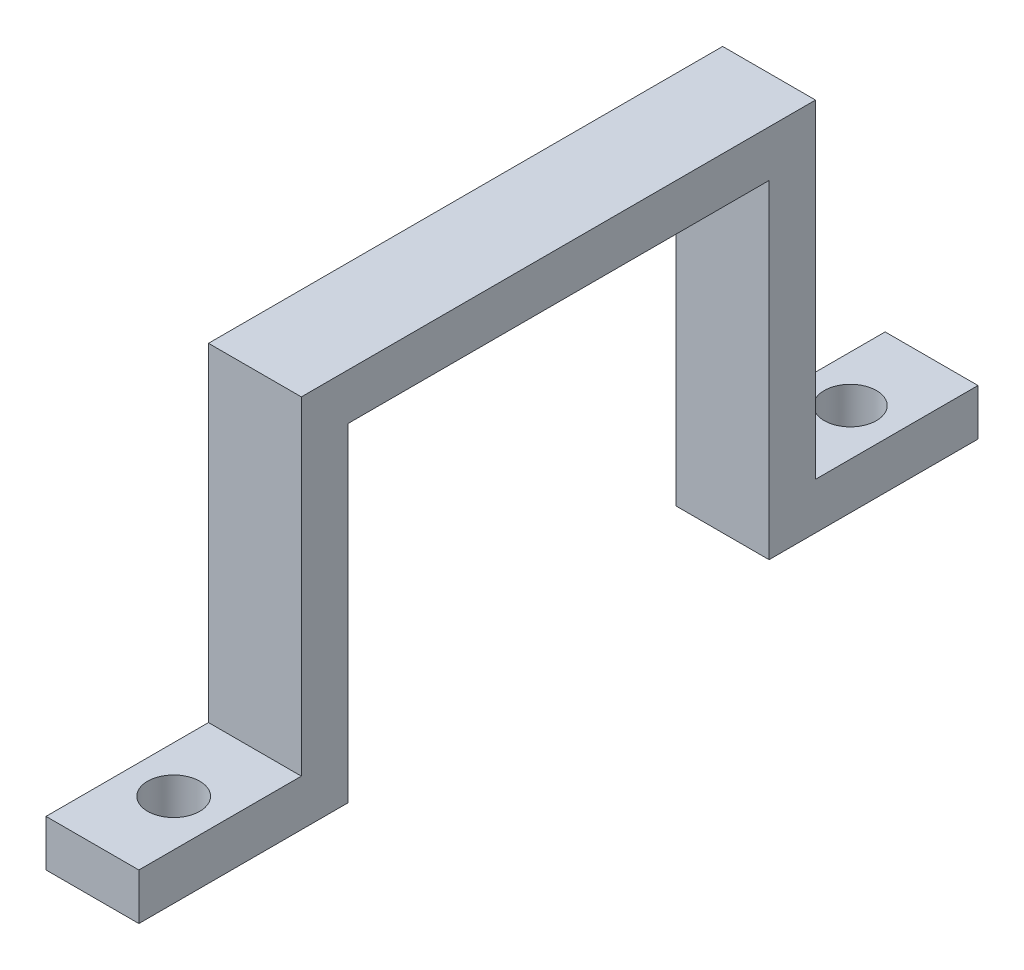
ISO-10303-21;
HEADER;
FILE_DESCRIPTION(('STEP AP214'),'2;1');
FILE_NAME('part.step','',(''),(''),'','','');
FILE_SCHEMA(('AUTOMOTIVE_DESIGN { 1 0 10303 214 1 1 1 1 }'));
ENDSEC;
DATA;
#1=APPLICATION_CONTEXT('core data for automotive mechanical design processes');
#2=APPLICATION_PROTOCOL_DEFINITION('international standard','automotive_design',2000,#1);
#3=PRODUCT_CONTEXT('',#1,'mechanical');
#4=PRODUCT('Part','Part','',(#3));
#5=PRODUCT_RELATED_PRODUCT_CATEGORY('part','',(#4));
#6=PRODUCT_DEFINITION_FORMATION('','',#4);
#7=PRODUCT_DEFINITION_CONTEXT('part definition',#1,'design');
#8=PRODUCT_DEFINITION('design','',#6,#7);
#9=PRODUCT_DEFINITION_SHAPE('','',#8);
#10=(LENGTH_UNIT() NAMED_UNIT(*) SI_UNIT(.MILLI.,.METRE.));
#11=(NAMED_UNIT(*) PLANE_ANGLE_UNIT() SI_UNIT($,.RADIAN.));
#12=(NAMED_UNIT(*) SI_UNIT($,.STERADIAN.) SOLID_ANGLE_UNIT());
#13=UNCERTAINTY_MEASURE_WITH_UNIT(LENGTH_MEASURE(1.E-05),#10,'distance_accuracy_value','');
#14=(GEOMETRIC_REPRESENTATION_CONTEXT(3) GLOBAL_UNCERTAINTY_ASSIGNED_CONTEXT((#13)) GLOBAL_UNIT_ASSIGNED_CONTEXT((#10,
#11,#12)) REPRESENTATION_CONTEXT('',''));
#15=CARTESIAN_POINT('',(0.,0.,0.));
#16=DIRECTION('',(0.,0.,1.));
#17=DIRECTION('',(1.,0.,0.));
#18=AXIS2_PLACEMENT_3D('',#15,#16,#17);
#19=CARTESIAN_POINT('',(4.,4.,36.15));
#20=DIRECTION('',(0.,0.,-1.));
#21=DIRECTION('',(-1.,0.,0.));
#22=AXIS2_PLACEMENT_3D('',#19,#20,#21);
#23=PLANE('',#22);
#24=DIRECTION('',(0.,-1.,0.));
#25=VECTOR('',#24,1.);
#26=CARTESIAN_POINT('',(-4.,4.,36.15));
#27=LINE('',#26,#25);
#28=CARTESIAN_POINT('',(-4.,4.,36.15));
#29=VERTEX_POINT('',#28);
#30=CARTESIAN_POINT('',(-4.,0.,36.15));
#31=VERTEX_POINT('',#30);
#32=EDGE_CURVE('E175',#29,#31,#27,.T.);
#33=ORIENTED_EDGE('',*,*,#32,.T.);
#34=DIRECTION('',(-1.,0.,0.));
#35=VECTOR('',#34,1.);
#36=CARTESIAN_POINT('',(4.,0.,36.15));
#37=LINE('',#36,#35);
#38=CARTESIAN_POINT('',(4.,0.,36.15));
#39=VERTEX_POINT('',#38);
#40=EDGE_CURVE('E11',#39,#31,#37,.T.);
#41=ORIENTED_EDGE('',*,*,#40,.F.);
#42=DIRECTION('',(0.,-1.,0.));
#43=VECTOR('',#42,1.);
#44=CARTESIAN_POINT('',(4.,4.,36.15));
#45=LINE('',#44,#43);
#46=CARTESIAN_POINT('',(4.,4.,36.15));
#47=VERTEX_POINT('',#46);
#48=EDGE_CURVE('E210',#47,#39,#45,.T.);
#49=ORIENTED_EDGE('',*,*,#48,.F.);
#50=DIRECTION('',(-1.,0.,0.));
#51=VECTOR('',#50,1.);
#52=CARTESIAN_POINT('',(4.,4.,36.15));
#53=LINE('',#52,#51);
#54=EDGE_CURVE('E169',#47,#29,#53,.T.);
#55=ORIENTED_EDGE('',*,*,#54,.T.);
#56=EDGE_LOOP('',(#33,#41,#49,#55));
#57=FACE_BOUND('',#56,.T.);
#58=ADVANCED_FACE('F44',(#57),#23,.F.);
#59=CARTESIAN_POINT('',(4.,0.,36.15));
#60=DIRECTION('',(0.,1.,0.));
#61=DIRECTION('',(0.,0.,1.));
#62=AXIS2_PLACEMENT_3D('',#59,#60,#61);
#63=PLANE('',#62);
#64=CARTESIAN_POINT('',(0.,0.,29.15));
#65=DIRECTION('',(0.,1.,0.));
#66=DIRECTION('',(0.,0.,1.));
#67=AXIS2_PLACEMENT_3D('',#64,#65,#66);
#68=CIRCLE('',#67,2.25);
#69=CARTESIAN_POINT('',(0.,0.,31.4));
#70=VERTEX_POINT('',#69);
#71=EDGE_CURVE('E242',#70,#70,#68,.F.);
#72=ORIENTED_EDGE('',*,*,#71,.F.);
#73=EDGE_LOOP('',(#72));
#74=FACE_BOUND('',#73,.T.);
#75=DIRECTION('',(0.,0.,-1.));
#76=VECTOR('',#75,1.);
#77=CARTESIAN_POINT('',(-4.,0.,36.15));
#78=LINE('',#77,#76);
#79=CARTESIAN_POINT('',(-4.,0.,18.15));
#80=VERTEX_POINT('',#79);
#81=EDGE_CURVE('E177',#31,#80,#78,.T.);
#82=ORIENTED_EDGE('',*,*,#81,.T.);
#83=DIRECTION('',(-1.,0.,0.));
#84=VECTOR('',#83,1.);
#85=CARTESIAN_POINT('',(4.,0.,18.15));
#86=LINE('',#85,#84);
#87=CARTESIAN_POINT('',(4.,0.,18.15));
#88=VERTEX_POINT('',#87);
#89=EDGE_CURVE('E54',#88,#80,#86,.T.);
#90=ORIENTED_EDGE('',*,*,#89,.F.);
#91=DIRECTION('',(0.,0.,-1.));
#92=VECTOR('',#91,1.);
#93=CARTESIAN_POINT('',(4.,0.,36.15));
#94=LINE('',#93,#92);
#95=EDGE_CURVE('E118',#39,#88,#94,.T.);
#96=ORIENTED_EDGE('',*,*,#95,.F.);
#97=ORIENTED_EDGE('',*,*,#40,.T.);
#98=EDGE_LOOP('',(#82,#90,#96,#97));
#99=FACE_BOUND('',#98,.T.);
#100=ADVANCED_FACE('F309',(#74,#99),#63,.F.);
#101=CARTESIAN_POINT('',(4.,0.,18.15));
#102=DIRECTION('',(0.,0.,1.));
#103=DIRECTION('',(1.,0.,0.));
#104=AXIS2_PLACEMENT_3D('',#101,#102,#103);
#105=PLANE('',#104);
#106=DIRECTION('',(0.,1.,0.));
#107=VECTOR('',#106,1.);
#108=CARTESIAN_POINT('',(-4.,0.,18.15));
#109=LINE('',#108,#107);
#110=CARTESIAN_POINT('',(-4.,28.3,18.15));
#111=VERTEX_POINT('',#110);
#112=EDGE_CURVE('E178',#80,#111,#109,.T.);
#113=ORIENTED_EDGE('',*,*,#112,.T.);
#114=DIRECTION('',(-1.,0.,0.));
#115=VECTOR('',#114,1.);
#116=CARTESIAN_POINT('',(4.,28.3,18.15));
#117=LINE('',#116,#115);
#118=CARTESIAN_POINT('',(4.,28.3,18.15));
#119=VERTEX_POINT('',#118);
#120=EDGE_CURVE('E231',#119,#111,#117,.T.);
#121=ORIENTED_EDGE('',*,*,#120,.F.);
#122=DIRECTION('',(0.,1.,0.));
#123=VECTOR('',#122,1.);
#124=CARTESIAN_POINT('',(4.,0.,18.15));
#125=LINE('',#124,#123);
#126=EDGE_CURVE('E261',#88,#119,#125,.T.);
#127=ORIENTED_EDGE('',*,*,#126,.F.);
#128=ORIENTED_EDGE('',*,*,#89,.T.);
#129=EDGE_LOOP('',(#113,#121,#127,#128));
#130=FACE_BOUND('',#129,.T.);
#131=ADVANCED_FACE('F312',(#130),#105,.F.);
#132=CARTESIAN_POINT('',(4.,28.3,18.15));
#133=DIRECTION('',(0.,1.,0.));
#134=DIRECTION('',(0.,0.,1.));
#135=AXIS2_PLACEMENT_3D('',#132,#133,#134);
#136=PLANE('',#135);
#137=DIRECTION('',(0.,0.,-1.));
#138=VECTOR('',#137,1.);
#139=CARTESIAN_POINT('',(-4.,28.3,18.15));
#140=LINE('',#139,#138);
#141=CARTESIAN_POINT('',(-4.,28.3,-18.15));
#142=VERTEX_POINT('',#141);
#143=EDGE_CURVE('E181',#111,#142,#140,.T.);
#144=ORIENTED_EDGE('',*,*,#143,.T.);
#145=DIRECTION('',(-1.,0.,0.));
#146=VECTOR('',#145,1.);
#147=CARTESIAN_POINT('',(4.,28.3,-18.15));
#148=LINE('',#147,#146);
#149=CARTESIAN_POINT('',(4.,28.3,-18.15));
#150=VERTEX_POINT('',#149);
#151=EDGE_CURVE('E229',#150,#142,#148,.T.);
#152=ORIENTED_EDGE('',*,*,#151,.F.);
#153=DIRECTION('',(0.,0.,-1.));
#154=VECTOR('',#153,1.);
#155=CARTESIAN_POINT('',(4.,28.3,18.15));
#156=LINE('',#155,#154);
#157=EDGE_CURVE('E262',#119,#150,#156,.T.);
#158=ORIENTED_EDGE('',*,*,#157,.F.);
#159=ORIENTED_EDGE('',*,*,#120,.T.);
#160=EDGE_LOOP('',(#144,#152,#158,#159));
#161=FACE_BOUND('',#160,.T.);
#162=ADVANCED_FACE('F321',(#161),#136,.F.);
#163=CARTESIAN_POINT('',(4.,28.3,-18.15));
#164=DIRECTION('',(0.,0.,-1.));
#165=DIRECTION('',(-1.,0.,0.));
#166=AXIS2_PLACEMENT_3D('',#163,#164,#165);
#167=PLANE('',#166);
#168=DIRECTION('',(0.,-1.,0.));
#169=VECTOR('',#168,1.);
#170=CARTESIAN_POINT('',(-4.,28.3,-18.15));
#171=LINE('',#170,#169);
#172=CARTESIAN_POINT('',(-4.,0.,-18.15));
#173=VERTEX_POINT('',#172);
#174=EDGE_CURVE('E186',#142,#173,#171,.T.);
#175=ORIENTED_EDGE('',*,*,#174,.T.);
#176=DIRECTION('',(-1.,0.,0.));
#177=VECTOR('',#176,1.);
#178=CARTESIAN_POINT('',(4.,0.,-18.15));
#179=LINE('',#178,#177);
#180=CARTESIAN_POINT('',(4.,0.,-18.15));
#181=VERTEX_POINT('',#180);
#182=EDGE_CURVE('E226',#181,#173,#179,.T.);
#183=ORIENTED_EDGE('',*,*,#182,.F.);
#184=DIRECTION('',(0.,-1.,0.));
#185=VECTOR('',#184,1.);
#186=CARTESIAN_POINT('',(4.,28.3,-18.15));
#187=LINE('',#186,#185);
#188=EDGE_CURVE('E270',#150,#181,#187,.T.);
#189=ORIENTED_EDGE('',*,*,#188,.F.);
#190=ORIENTED_EDGE('',*,*,#151,.T.);
#191=EDGE_LOOP('',(#175,#183,#189,#190));
#192=FACE_BOUND('',#191,.T.);
#193=ADVANCED_FACE('F330',(#192),#167,.F.);
#194=CARTESIAN_POINT('',(4.,0.,-18.15));
#195=DIRECTION('',(0.,1.,0.));
#196=DIRECTION('',(0.,0.,1.));
#197=AXIS2_PLACEMENT_3D('',#194,#195,#196);
#198=PLANE('',#197);
#199=CARTESIAN_POINT('',(0.,0.,-29.15));
#200=DIRECTION('',(0.,1.,0.));
#201=DIRECTION('',(0.,0.,1.));
#202=AXIS2_PLACEMENT_3D('',#199,#200,#201);
#203=CIRCLE('',#202,2.25);
#204=CARTESIAN_POINT('',(0.,0.,-26.9));
#205=VERTEX_POINT('',#204);
#206=EDGE_CURVE('E180',#205,#205,#203,.F.);
#207=ORIENTED_EDGE('',*,*,#206,.F.);
#208=EDGE_LOOP('',(#207));
#209=FACE_BOUND('',#208,.T.);
#210=DIRECTION('',(0.,0.,-1.));
#211=VECTOR('',#210,1.);
#212=CARTESIAN_POINT('',(-4.,0.,-18.15));
#213=LINE('',#212,#211);
#214=CARTESIAN_POINT('',(-4.,0.,-36.15));
#215=VERTEX_POINT('',#214);
#216=EDGE_CURVE('E188',#173,#215,#213,.T.);
#217=ORIENTED_EDGE('',*,*,#216,.T.);
#218=DIRECTION('',(-1.,0.,0.));
#219=VECTOR('',#218,1.);
#220=CARTESIAN_POINT('',(4.,0.,-36.15));
#221=LINE('',#220,#219);
#222=CARTESIAN_POINT('',(4.,0.,-36.15));
#223=VERTEX_POINT('',#222);
#224=EDGE_CURVE('E225',#223,#215,#221,.T.);
#225=ORIENTED_EDGE('',*,*,#224,.F.);
#226=DIRECTION('',(0.,0.,-1.));
#227=VECTOR('',#226,1.);
#228=CARTESIAN_POINT('',(4.,0.,-18.15));
#229=LINE('',#228,#227);
#230=EDGE_CURVE('E269',#181,#223,#229,.T.);
#231=ORIENTED_EDGE('',*,*,#230,.F.);
#232=ORIENTED_EDGE('',*,*,#182,.T.);
#233=EDGE_LOOP('',(#217,#225,#231,#232));
#234=FACE_BOUND('',#233,.T.);
#235=ADVANCED_FACE('F332',(#209,#234),#198,.F.);
#236=CARTESIAN_POINT('',(4.,0.,-36.15));
#237=DIRECTION('',(0.,0.,1.));
#238=DIRECTION('',(1.,0.,0.));
#239=AXIS2_PLACEMENT_3D('',#236,#237,#238);
#240=PLANE('',#239);
#241=DIRECTION('',(0.,1.,0.));
#242=VECTOR('',#241,1.);
#243=CARTESIAN_POINT('',(-4.,0.,-36.15));
#244=LINE('',#243,#242);
#245=CARTESIAN_POINT('',(-4.,4.,-36.15));
#246=VERTEX_POINT('',#245);
#247=EDGE_CURVE('E195',#215,#246,#244,.T.);
#248=ORIENTED_EDGE('',*,*,#247,.T.);
#249=DIRECTION('',(-1.,0.,0.));
#250=VECTOR('',#249,1.);
#251=CARTESIAN_POINT('',(4.,4.,-36.15));
#252=LINE('',#251,#250);
#253=CARTESIAN_POINT('',(4.,4.,-36.15));
#254=VERTEX_POINT('',#253);
#255=EDGE_CURVE('E217',#254,#246,#252,.T.);
#256=ORIENTED_EDGE('',*,*,#255,.F.);
#257=DIRECTION('',(0.,1.,0.));
#258=VECTOR('',#257,1.);
#259=CARTESIAN_POINT('',(4.,0.,-36.15));
#260=LINE('',#259,#258);
#261=EDGE_CURVE('E272',#223,#254,#260,.T.);
#262=ORIENTED_EDGE('',*,*,#261,.F.);
#263=ORIENTED_EDGE('',*,*,#224,.T.);
#264=EDGE_LOOP('',(#248,#256,#262,#263));
#265=FACE_BOUND('',#264,.T.);
#266=ADVANCED_FACE('F331',(#265),#240,.F.);
#267=CARTESIAN_POINT('',(4.,4.,-36.15));
#268=DIRECTION('',(0.,-1.,0.));
#269=DIRECTION('',(0.,0.,-1.));
#270=AXIS2_PLACEMENT_3D('',#267,#268,#269);
#271=PLANE('',#270);
#272=CARTESIAN_POINT('',(0.,4.,-29.15));
#273=DIRECTION('',(0.,-1.,0.));
#274=DIRECTION('',(0.,0.,-1.));
#275=AXIS2_PLACEMENT_3D('',#272,#273,#274);
#276=CIRCLE('',#275,2.25);
#277=CARTESIAN_POINT('',(0.,4.,-31.4));
#278=VERTEX_POINT('',#277);
#279=EDGE_CURVE('E48',#278,#278,#276,.F.);
#280=ORIENTED_EDGE('',*,*,#279,.F.);
#281=EDGE_LOOP('',(#280));
#282=FACE_BOUND('',#281,.T.);
#283=DIRECTION('',(0.,0.,1.));
#284=VECTOR('',#283,1.);
#285=CARTESIAN_POINT('',(-4.,4.,-36.15));
#286=LINE('',#285,#284);
#287=CARTESIAN_POINT('',(-4.,4.,-22.15));
#288=VERTEX_POINT('',#287);
#289=EDGE_CURVE('E193',#246,#288,#286,.T.);
#290=ORIENTED_EDGE('',*,*,#289,.T.);
#291=DIRECTION('',(-1.,0.,0.));
#292=VECTOR('',#291,1.);
#293=CARTESIAN_POINT('',(4.,4.,-22.15));
#294=LINE('',#293,#292);
#295=CARTESIAN_POINT('',(4.,4.,-22.15));
#296=VERTEX_POINT('',#295);
#297=EDGE_CURVE('E212',#296,#288,#294,.T.);
#298=ORIENTED_EDGE('',*,*,#297,.F.);
#299=DIRECTION('',(0.,0.,1.));
#300=VECTOR('',#299,1.);
#301=CARTESIAN_POINT('',(4.,4.,-36.15));
#302=LINE('',#301,#300);
#303=EDGE_CURVE('E277',#254,#296,#302,.T.);
#304=ORIENTED_EDGE('',*,*,#303,.F.);
#305=ORIENTED_EDGE('',*,*,#255,.T.);
#306=EDGE_LOOP('',(#290,#298,#304,#305));
#307=FACE_BOUND('',#306,.T.);
#308=ADVANCED_FACE('F283',(#282,#307),#271,.F.);
#309=CARTESIAN_POINT('',(4.,4.,-22.15));
#310=DIRECTION('',(0.,0.,1.));
#311=DIRECTION('',(1.,0.,0.));
#312=AXIS2_PLACEMENT_3D('',#309,#310,#311);
#313=PLANE('',#312);
#314=DIRECTION('',(0.,1.,0.));
#315=VECTOR('',#314,1.);
#316=CARTESIAN_POINT('',(-4.,4.,-22.15));
#317=LINE('',#316,#315);
#318=CARTESIAN_POINT('',(-4.,32.3,-22.15));
#319=VERTEX_POINT('',#318);
#320=EDGE_CURVE('E196',#288,#319,#317,.T.);
#321=ORIENTED_EDGE('',*,*,#320,.T.);
#322=DIRECTION('',(-1.,0.,0.));
#323=VECTOR('',#322,1.);
#324=CARTESIAN_POINT('',(4.,32.3,-22.15));
#325=LINE('',#324,#323);
#326=CARTESIAN_POINT('',(4.,32.3,-22.15));
#327=VERTEX_POINT('',#326);
#328=EDGE_CURVE('E161',#327,#319,#325,.T.);
#329=ORIENTED_EDGE('',*,*,#328,.F.);
#330=DIRECTION('',(0.,1.,0.));
#331=VECTOR('',#330,1.);
#332=CARTESIAN_POINT('',(4.,4.,-22.15));
#333=LINE('',#332,#331);
#334=EDGE_CURVE('E147',#296,#327,#333,.T.);
#335=ORIENTED_EDGE('',*,*,#334,.F.);
#336=ORIENTED_EDGE('',*,*,#297,.T.);
#337=EDGE_LOOP('',(#321,#329,#335,#336));
#338=FACE_BOUND('',#337,.T.);
#339=ADVANCED_FACE('F289',(#338),#313,.F.);
#340=CARTESIAN_POINT('',(4.,32.3,-22.15));
#341=DIRECTION('',(0.,-1.,0.));
#342=DIRECTION('',(0.,0.,-1.));
#343=AXIS2_PLACEMENT_3D('',#340,#341,#342);
#344=PLANE('',#343);
#345=DIRECTION('',(0.,0.,1.));
#346=VECTOR('',#345,1.);
#347=CARTESIAN_POINT('',(-4.,32.3,-22.15));
#348=LINE('',#347,#346);
#349=CARTESIAN_POINT('',(-4.,32.3,22.15));
#350=VERTEX_POINT('',#349);
#351=EDGE_CURVE('E157',#319,#350,#348,.T.);
#352=ORIENTED_EDGE('',*,*,#351,.T.);
#353=DIRECTION('',(-1.,0.,0.));
#354=VECTOR('',#353,1.);
#355=CARTESIAN_POINT('',(4.,32.3,22.15));
#356=LINE('',#355,#354);
#357=CARTESIAN_POINT('',(4.,32.3,22.15));
#358=VERTEX_POINT('',#357);
#359=EDGE_CURVE('E156',#358,#350,#356,.T.);
#360=ORIENTED_EDGE('',*,*,#359,.F.);
#361=DIRECTION('',(0.,0.,1.));
#362=VECTOR('',#361,1.);
#363=CARTESIAN_POINT('',(4.,32.3,-22.15));
#364=LINE('',#363,#362);
#365=EDGE_CURVE('E145',#327,#358,#364,.T.);
#366=ORIENTED_EDGE('',*,*,#365,.F.);
#367=ORIENTED_EDGE('',*,*,#328,.T.);
#368=EDGE_LOOP('',(#352,#360,#366,#367));
#369=FACE_BOUND('',#368,.T.);
#370=ADVANCED_FACE('F160',(#369),#344,.F.);
#371=CARTESIAN_POINT('',(4.,32.3,22.15));
#372=DIRECTION('',(0.,0.,-1.));
#373=DIRECTION('',(-1.,0.,0.));
#374=AXIS2_PLACEMENT_3D('',#371,#372,#373);
#375=PLANE('',#374);
#376=DIRECTION('',(0.,-1.,0.));
#377=VECTOR('',#376,1.);
#378=CARTESIAN_POINT('',(-4.,32.3,22.15));
#379=LINE('',#378,#377);
#380=CARTESIAN_POINT('',(-4.,4.,22.15));
#381=VERTEX_POINT('',#380);
#382=EDGE_CURVE('E104',#350,#381,#379,.T.);
#383=ORIENTED_EDGE('',*,*,#382,.T.);
#384=DIRECTION('',(-1.,0.,0.));
#385=VECTOR('',#384,1.);
#386=CARTESIAN_POINT('',(4.,4.,22.15));
#387=LINE('',#386,#385);
#388=CARTESIAN_POINT('',(4.,4.,22.15));
#389=VERTEX_POINT('',#388);
#390=EDGE_CURVE('E165',#389,#381,#387,.T.);
#391=ORIENTED_EDGE('',*,*,#390,.F.);
#392=DIRECTION('',(0.,-1.,0.));
#393=VECTOR('',#392,1.);
#394=CARTESIAN_POINT('',(4.,32.3,22.15));
#395=LINE('',#394,#393);
#396=EDGE_CURVE('E146',#358,#389,#395,.T.);
#397=ORIENTED_EDGE('',*,*,#396,.F.);
#398=ORIENTED_EDGE('',*,*,#359,.T.);
#399=EDGE_LOOP('',(#383,#391,#397,#398));
#400=FACE_BOUND('',#399,.T.);
#401=ADVANCED_FACE('F163',(#400),#375,.F.);
#402=CARTESIAN_POINT('',(4.,4.,22.15));
#403=DIRECTION('',(0.,-1.,0.));
#404=DIRECTION('',(0.,0.,-1.));
#405=AXIS2_PLACEMENT_3D('',#402,#403,#404);
#406=PLANE('',#405);
#407=CARTESIAN_POINT('',(0.,4.,29.15));
#408=DIRECTION('',(0.,-1.,0.));
#409=DIRECTION('',(0.,0.,-1.));
#410=AXIS2_PLACEMENT_3D('',#407,#408,#409);
#411=CIRCLE('',#410,2.25);
#412=CARTESIAN_POINT('',(0.,4.,26.9));
#413=VERTEX_POINT('',#412);
#414=EDGE_CURVE('E238',#413,#413,#411,.F.);
#415=ORIENTED_EDGE('',*,*,#414,.F.);
#416=EDGE_LOOP('',(#415));
#417=FACE_BOUND('',#416,.T.);
#418=DIRECTION('',(0.,0.,1.));
#419=VECTOR('',#418,1.);
#420=CARTESIAN_POINT('',(-4.,4.,22.15));
#421=LINE('',#420,#419);
#422=EDGE_CURVE('E112',#381,#29,#421,.T.);
#423=ORIENTED_EDGE('',*,*,#422,.T.);
#424=ORIENTED_EDGE('',*,*,#54,.F.);
#425=DIRECTION('',(0.,0.,1.));
#426=VECTOR('',#425,1.);
#427=CARTESIAN_POINT('',(4.,4.,22.15));
#428=LINE('',#427,#426);
#429=EDGE_CURVE('E63',#389,#47,#428,.T.);
#430=ORIENTED_EDGE('',*,*,#429,.F.);
#431=ORIENTED_EDGE('',*,*,#390,.T.);
#432=EDGE_LOOP('',(#423,#424,#430,#431));
#433=FACE_BOUND('',#432,.T.);
#434=ADVANCED_FACE('F296',(#417,#433),#406,.F.);
#435=CARTESIAN_POINT('',(4.,0.,0.));
#436=DIRECTION('',(1.,0.,0.));
#437=DIRECTION('',(0.,0.,-1.));
#438=AXIS2_PLACEMENT_3D('',#435,#436,#437);
#439=PLANE('',#438);
#440=ORIENTED_EDGE('',*,*,#48,.T.);
#441=ORIENTED_EDGE('',*,*,#95,.T.);
#442=ORIENTED_EDGE('',*,*,#126,.T.);
#443=ORIENTED_EDGE('',*,*,#157,.T.);
#444=ORIENTED_EDGE('',*,*,#188,.T.);
#445=ORIENTED_EDGE('',*,*,#230,.T.);
#446=ORIENTED_EDGE('',*,*,#261,.T.);
#447=ORIENTED_EDGE('',*,*,#303,.T.);
#448=ORIENTED_EDGE('',*,*,#334,.T.);
#449=ORIENTED_EDGE('',*,*,#365,.T.);
#450=ORIENTED_EDGE('',*,*,#396,.T.);
#451=ORIENTED_EDGE('',*,*,#429,.T.);
#452=EDGE_LOOP('',(#440,#441,#442,#443,#444,#445,#446,#447,#448,#449,#450,#451));
#453=FACE_BOUND('',#452,.T.);
#454=ADVANCED_FACE('F148',(#453),#439,.T.);
#455=CARTESIAN_POINT('',(-4.,0.,0.));
#456=DIRECTION('',(1.,0.,0.));
#457=DIRECTION('',(0.,0.,-1.));
#458=AXIS2_PLACEMENT_3D('',#455,#456,#457);
#459=PLANE('',#458);
#460=ORIENTED_EDGE('',*,*,#32,.F.);
#461=ORIENTED_EDGE('',*,*,#422,.F.);
#462=ORIENTED_EDGE('',*,*,#382,.F.);
#463=ORIENTED_EDGE('',*,*,#351,.F.);
#464=ORIENTED_EDGE('',*,*,#320,.F.);
#465=ORIENTED_EDGE('',*,*,#289,.F.);
#466=ORIENTED_EDGE('',*,*,#247,.F.);
#467=ORIENTED_EDGE('',*,*,#216,.F.);
#468=ORIENTED_EDGE('',*,*,#174,.F.);
#469=ORIENTED_EDGE('',*,*,#143,.F.);
#470=ORIENTED_EDGE('',*,*,#112,.F.);
#471=ORIENTED_EDGE('',*,*,#81,.F.);
#472=EDGE_LOOP('',(#460,#461,#462,#463,#464,#465,#466,#467,#468,#469,#470,#471));
#473=FACE_BOUND('',#472,.T.);
#474=ADVANCED_FACE('F292',(#473),#459,.F.);
#475=CARTESIAN_POINT('',(0.,4.5,29.15));
#476=DIRECTION('',(0.,-1.,0.));
#477=DIRECTION('',(0.,0.,-1.));
#478=AXIS2_PLACEMENT_3D('',#475,#476,#477);
#479=CYLINDRICAL_SURFACE('',#478,2.25);
#480=ORIENTED_EDGE('',*,*,#414,.T.);
#481=EDGE_LOOP('',(#480));
#482=FACE_BOUND('',#481,.T.);
#483=ORIENTED_EDGE('',*,*,#71,.T.);
#484=EDGE_LOOP('',(#483));
#485=FACE_BOUND('',#484,.T.);
#486=ADVANCED_FACE('F361',(#482,#485),#479,.F.);
#487=CARTESIAN_POINT('',(0.,4.5,-29.15));
#488=DIRECTION('',(0.,-1.,0.));
#489=DIRECTION('',(0.,0.,-1.));
#490=AXIS2_PLACEMENT_3D('',#487,#488,#489);
#491=CYLINDRICAL_SURFACE('',#490,2.25);
#492=ORIENTED_EDGE('',*,*,#279,.T.);
#493=EDGE_LOOP('',(#492));
#494=FACE_BOUND('',#493,.T.);
#495=ORIENTED_EDGE('',*,*,#206,.T.);
#496=EDGE_LOOP('',(#495));
#497=FACE_BOUND('',#496,.T.);
#498=ADVANCED_FACE('F373',(#494,#497),#491,.F.);
#499=CLOSED_SHELL('',(#58,#100,#131,#162,#193,#235,#266,#308,#339,#370,#401,#434,#454,#474,#486,#498));
#500=MANIFOLD_SOLID_BREP('B2',#499);
#501=ADVANCED_BREP_SHAPE_REPRESENTATION('',(#18,#500),#14);
#502=SHAPE_DEFINITION_REPRESENTATION(#9,#501);
ENDSEC;
END-ISO-10303-21;
